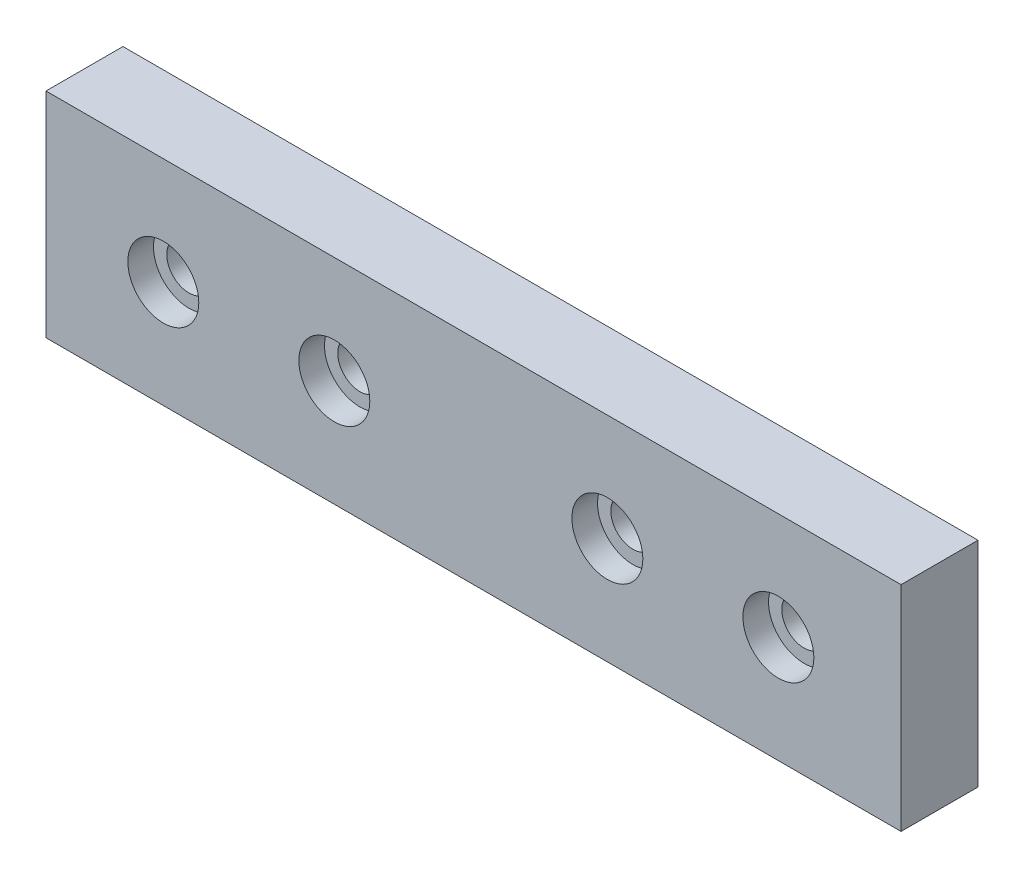
ISO-10303-21;
HEADER;
FILE_DESCRIPTION(('STEP AP214'),'2;1');
FILE_NAME('part.step','',(''),(''),'','','');
FILE_SCHEMA(('AUTOMOTIVE_DESIGN { 1 0 10303 214 1 1 1 1 }'));
ENDSEC;
DATA;
#1=APPLICATION_CONTEXT('core data for automotive mechanical design processes');
#2=APPLICATION_PROTOCOL_DEFINITION('international standard','automotive_design',2000,#1);
#3=PRODUCT_CONTEXT('',#1,'mechanical');
#4=PRODUCT('Part','Part','',(#3));
#5=PRODUCT_RELATED_PRODUCT_CATEGORY('part','',(#4));
#6=PRODUCT_DEFINITION_FORMATION('','',#4);
#7=PRODUCT_DEFINITION_CONTEXT('part definition',#1,'design');
#8=PRODUCT_DEFINITION('design','',#6,#7);
#9=PRODUCT_DEFINITION_SHAPE('','',#8);
#10=(LENGTH_UNIT() NAMED_UNIT(*) SI_UNIT(.MILLI.,.METRE.));
#11=(NAMED_UNIT(*) PLANE_ANGLE_UNIT() SI_UNIT($,.RADIAN.));
#12=(NAMED_UNIT(*) SI_UNIT($,.STERADIAN.) SOLID_ANGLE_UNIT());
#13=UNCERTAINTY_MEASURE_WITH_UNIT(LENGTH_MEASURE(1.E-05),#10,'distance_accuracy_value','');
#14=(GEOMETRIC_REPRESENTATION_CONTEXT(3) GLOBAL_UNCERTAINTY_ASSIGNED_CONTEXT((#13)) GLOBAL_UNIT_ASSIGNED_CONTEXT((#10,
#11,#12)) REPRESENTATION_CONTEXT('',''));
#15=CARTESIAN_POINT('',(0.,0.,0.));
#16=DIRECTION('',(0.,0.,1.));
#17=DIRECTION('',(1.,0.,0.));
#18=AXIS2_PLACEMENT_3D('',#15,#16,#17);
#19=CARTESIAN_POINT('',(-85.3473640143417,12.5,-75.));
#20=DIRECTION('',(0.,0.,1.));
#21=DIRECTION('',(1.,0.,0.));
#22=AXIS2_PLACEMENT_3D('',#19,#20,#21);
#23=CYLINDRICAL_SURFACE('',#22,2.6);
#24=CARTESIAN_POINT('',(-85.3473640143417,12.5,17.5));
#25=DIRECTION('',(0.,0.,1.));
#26=DIRECTION('',(1.,0.,0.));
#27=AXIS2_PLACEMENT_3D('',#24,#25,#26);
#28=CIRCLE('',#27,2.6);
#29=CARTESIAN_POINT('',(-82.7473640143417,12.5,17.5));
#30=VERTEX_POINT('',#29);
#31=EDGE_CURVE('E108',#30,#30,#28,.T.);
#32=ORIENTED_EDGE('',*,*,#31,.F.);
#33=EDGE_LOOP('',(#32));
#34=FACE_BOUND('',#33,.T.);
#35=CARTESIAN_POINT('',(-85.3473640143417,12.5,23.5));
#36=DIRECTION('',(0.,0.,1.));
#37=DIRECTION('',(1.,0.,0.));
#38=AXIS2_PLACEMENT_3D('',#35,#36,#37);
#39=CIRCLE('',#38,2.6);
#40=CARTESIAN_POINT('',(-82.7473640143417,12.5,23.5));
#41=VERTEX_POINT('',#40);
#42=EDGE_CURVE('E36',#41,#41,#39,.F.);
#43=ORIENTED_EDGE('',*,*,#42,.F.);
#44=EDGE_LOOP('',(#43));
#45=FACE_BOUND('',#44,.T.);
#46=ADVANCED_FACE('F32',(#34,#45),#23,.F.);
#47=CARTESIAN_POINT('',(-157.28059455583,12.5,-75.));
#48=DIRECTION('',(0.,0.,1.));
#49=DIRECTION('',(1.,0.,0.));
#50=AXIS2_PLACEMENT_3D('',#47,#48,#49);
#51=CYLINDRICAL_SURFACE('',#50,2.59999999999999);
#52=CARTESIAN_POINT('',(-157.28059455583,12.5,17.5));
#53=DIRECTION('',(0.,0.,1.));
#54=DIRECTION('',(1.,0.,0.));
#55=AXIS2_PLACEMENT_3D('',#52,#53,#54);
#56=CIRCLE('',#55,2.59999999999999);
#57=CARTESIAN_POINT('',(-154.68059455583,12.5,17.5));
#58=VERTEX_POINT('',#57);
#59=EDGE_CURVE('E111',#58,#58,#56,.T.);
#60=ORIENTED_EDGE('',*,*,#59,.F.);
#61=EDGE_LOOP('',(#60));
#62=FACE_BOUND('',#61,.T.);
#63=CARTESIAN_POINT('',(-157.28059455583,12.5,23.5));
#64=DIRECTION('',(0.,0.,1.));
#65=DIRECTION('',(1.,0.,0.));
#66=AXIS2_PLACEMENT_3D('',#63,#64,#65);
#67=CIRCLE('',#66,2.59999999999999);
#68=CARTESIAN_POINT('',(-154.68059455583,12.5,23.5));
#69=VERTEX_POINT('',#68);
#70=EDGE_CURVE('E125',#69,#69,#67,.F.);
#71=ORIENTED_EDGE('',*,*,#70,.F.);
#72=EDGE_LOOP('',(#71));
#73=FACE_BOUND('',#72,.T.);
#74=ADVANCED_FACE('F135',(#62,#73),#51,.F.);
#75=CARTESIAN_POINT('',(-105.347364014342,12.5,-75.));
#76=DIRECTION('',(0.,0.,1.));
#77=DIRECTION('',(1.,0.,0.));
#78=AXIS2_PLACEMENT_3D('',#75,#76,#77);
#79=CYLINDRICAL_SURFACE('',#78,2.6);
#80=CARTESIAN_POINT('',(-105.347364014342,12.5,17.5));
#81=DIRECTION('',(0.,0.,1.));
#82=DIRECTION('',(1.,0.,0.));
#83=AXIS2_PLACEMENT_3D('',#80,#81,#82);
#84=CIRCLE('',#83,2.6);
#85=CARTESIAN_POINT('',(-102.747364014342,12.5,17.5));
#86=VERTEX_POINT('',#85);
#87=EDGE_CURVE('E114',#86,#86,#84,.T.);
#88=ORIENTED_EDGE('',*,*,#87,.F.);
#89=EDGE_LOOP('',(#88));
#90=FACE_BOUND('',#89,.T.);
#91=CARTESIAN_POINT('',(-105.347364014342,12.5,23.5));
#92=DIRECTION('',(0.,0.,1.));
#93=DIRECTION('',(1.,0.,0.));
#94=AXIS2_PLACEMENT_3D('',#91,#92,#93);
#95=CIRCLE('',#94,2.6);
#96=CARTESIAN_POINT('',(-102.747364014342,12.5,23.5));
#97=VERTEX_POINT('',#96);
#98=EDGE_CURVE('E122',#97,#97,#95,.F.);
#99=ORIENTED_EDGE('',*,*,#98,.F.);
#100=EDGE_LOOP('',(#99));
#101=FACE_BOUND('',#100,.T.);
#102=ADVANCED_FACE('F141',(#90,#101),#79,.F.);
#103=CARTESIAN_POINT('',(-137.28059455583,12.5,-75.));
#104=DIRECTION('',(0.,0.,1.));
#105=DIRECTION('',(1.,0.,0.));
#106=AXIS2_PLACEMENT_3D('',#103,#104,#105);
#107=CYLINDRICAL_SURFACE('',#106,2.59999999999999);
#108=CARTESIAN_POINT('',(-137.28059455583,12.5,17.5));
#109=DIRECTION('',(0.,0.,1.));
#110=DIRECTION('',(1.,0.,0.));
#111=AXIS2_PLACEMENT_3D('',#108,#109,#110);
#112=CIRCLE('',#111,2.59999999999999);
#113=CARTESIAN_POINT('',(-134.68059455583,12.5,17.5));
#114=VERTEX_POINT('',#113);
#115=EDGE_CURVE('E102',#114,#114,#112,.T.);
#116=ORIENTED_EDGE('',*,*,#115,.F.);
#117=EDGE_LOOP('',(#116));
#118=FACE_BOUND('',#117,.T.);
#119=CARTESIAN_POINT('',(-137.28059455583,12.5,23.5));
#120=DIRECTION('',(0.,0.,1.));
#121=DIRECTION('',(1.,0.,0.));
#122=AXIS2_PLACEMENT_3D('',#119,#120,#121);
#123=CIRCLE('',#122,2.59999999999999);
#124=CARTESIAN_POINT('',(-134.68059455583,12.5,23.5));
#125=VERTEX_POINT('',#124);
#126=EDGE_CURVE('E119',#125,#125,#123,.F.);
#127=ORIENTED_EDGE('',*,*,#126,.F.);
#128=EDGE_LOOP('',(#127));
#129=FACE_BOUND('',#128,.T.);
#130=ADVANCED_FACE('F163',(#118,#129),#107,.F.);
#131=CARTESIAN_POINT('',(-71.,0.,26.5));
#132=DIRECTION('',(-1.,0.,0.));
#133=DIRECTION('',(0.,0.,1.));
#134=AXIS2_PLACEMENT_3D('',#131,#132,#133);
#135=PLANE('',#134);
#136=DIRECTION('',(0.,1.,0.));
#137=VECTOR('',#136,1.);
#138=CARTESIAN_POINT('',(-71.,0.,17.5));
#139=LINE('',#138,#137);
#140=CARTESIAN_POINT('',(-71.,0.,17.5));
#141=VERTEX_POINT('',#140);
#142=CARTESIAN_POINT('',(-71.,25.,17.5));
#143=VERTEX_POINT('',#142);
#144=EDGE_CURVE('E99',#141,#143,#139,.T.);
#145=ORIENTED_EDGE('',*,*,#144,.T.);
#146=DIRECTION('',(0.,0.,-1.));
#147=VECTOR('',#146,1.);
#148=CARTESIAN_POINT('',(-71.,25.,26.5));
#149=LINE('',#148,#147);
#150=CARTESIAN_POINT('',(-71.,25.,26.5));
#151=VERTEX_POINT('',#150);
#152=EDGE_CURVE('E11',#151,#143,#149,.T.);
#153=ORIENTED_EDGE('',*,*,#152,.F.);
#154=DIRECTION('',(0.,1.,0.));
#155=VECTOR('',#154,1.);
#156=CARTESIAN_POINT('',(-71.,0.,26.5));
#157=LINE('',#156,#155);
#158=CARTESIAN_POINT('',(-71.,0.,26.5));
#159=VERTEX_POINT('',#158);
#160=EDGE_CURVE('E86',#159,#151,#157,.T.);
#161=ORIENTED_EDGE('',*,*,#160,.F.);
#162=DIRECTION('',(0.,0.,-1.));
#163=VECTOR('',#162,1.);
#164=CARTESIAN_POINT('',(-71.,0.,26.5));
#165=LINE('',#164,#163);
#166=EDGE_CURVE('E95',#159,#141,#165,.T.);
#167=ORIENTED_EDGE('',*,*,#166,.T.);
#168=EDGE_LOOP('',(#145,#153,#161,#167));
#169=FACE_BOUND('',#168,.T.);
#170=ADVANCED_FACE('F34',(#169),#135,.F.);
#171=CARTESIAN_POINT('',(-71.,25.,26.5));
#172=DIRECTION('',(0.,-1.,0.));
#173=DIRECTION('',(0.,0.,-1.));
#174=AXIS2_PLACEMENT_3D('',#171,#172,#173);
#175=PLANE('',#174);
#176=DIRECTION('',(-1.,0.,0.));
#177=VECTOR('',#176,1.);
#178=CARTESIAN_POINT('',(-71.,25.,17.5));
#179=LINE('',#178,#177);
#180=CARTESIAN_POINT('',(-171.,25.,17.5));
#181=VERTEX_POINT('',#180);
#182=EDGE_CURVE('E90',#143,#181,#179,.T.);
#183=ORIENTED_EDGE('',*,*,#182,.T.);
#184=DIRECTION('',(0.,0.,-1.));
#185=VECTOR('',#184,1.);
#186=CARTESIAN_POINT('',(-171.,25.,26.5));
#187=LINE('',#186,#185);
#188=CARTESIAN_POINT('',(-171.,25.,26.5));
#189=VERTEX_POINT('',#188);
#190=EDGE_CURVE('E42',#189,#181,#187,.T.);
#191=ORIENTED_EDGE('',*,*,#190,.F.);
#192=DIRECTION('',(-1.,0.,0.));
#193=VECTOR('',#192,1.);
#194=CARTESIAN_POINT('',(-71.,25.,26.5));
#195=LINE('',#194,#193);
#196=EDGE_CURVE('E81',#151,#189,#195,.T.);
#197=ORIENTED_EDGE('',*,*,#196,.F.);
#198=ORIENTED_EDGE('',*,*,#152,.T.);
#199=EDGE_LOOP('',(#183,#191,#197,#198));
#200=FACE_BOUND('',#199,.T.);
#201=ADVANCED_FACE('F89',(#200),#175,.F.);
#202=CARTESIAN_POINT('',(-171.,25.,26.5));
#203=DIRECTION('',(1.,0.,0.));
#204=DIRECTION('',(0.,0.,-1.));
#205=AXIS2_PLACEMENT_3D('',#202,#203,#204);
#206=PLANE('',#205);
#207=DIRECTION('',(0.,-1.,0.));
#208=VECTOR('',#207,1.);
#209=CARTESIAN_POINT('',(-171.,25.,17.5));
#210=LINE('',#209,#208);
#211=CARTESIAN_POINT('',(-171.,0.,17.5));
#212=VERTEX_POINT('',#211);
#213=EDGE_CURVE('E68',#181,#212,#210,.T.);
#214=ORIENTED_EDGE('',*,*,#213,.T.);
#215=DIRECTION('',(0.,0.,-1.));
#216=VECTOR('',#215,1.);
#217=CARTESIAN_POINT('',(-171.,0.,26.5));
#218=LINE('',#217,#216);
#219=CARTESIAN_POINT('',(-171.,0.,26.5));
#220=VERTEX_POINT('',#219);
#221=EDGE_CURVE('E91',#220,#212,#218,.T.);
#222=ORIENTED_EDGE('',*,*,#221,.F.);
#223=DIRECTION('',(0.,-1.,0.));
#224=VECTOR('',#223,1.);
#225=CARTESIAN_POINT('',(-171.,25.,26.5));
#226=LINE('',#225,#224);
#227=EDGE_CURVE('E84',#189,#220,#226,.T.);
#228=ORIENTED_EDGE('',*,*,#227,.F.);
#229=ORIENTED_EDGE('',*,*,#190,.T.);
#230=EDGE_LOOP('',(#214,#222,#228,#229));
#231=FACE_BOUND('',#230,.T.);
#232=ADVANCED_FACE('F93',(#231),#206,.F.);
#233=CARTESIAN_POINT('',(-171.,0.,26.5));
#234=DIRECTION('',(0.,1.,0.));
#235=DIRECTION('',(-1.,0.,0.));
#236=AXIS2_PLACEMENT_3D('',#233,#234,#235);
#237=PLANE('',#236);
#238=DIRECTION('',(1.,0.,0.));
#239=VECTOR('',#238,1.);
#240=CARTESIAN_POINT('',(-171.,0.,17.5));
#241=LINE('',#240,#239);
#242=EDGE_CURVE('E74',#212,#141,#241,.T.);
#243=ORIENTED_EDGE('',*,*,#242,.T.);
#244=ORIENTED_EDGE('',*,*,#166,.F.);
#245=DIRECTION('',(1.,0.,0.));
#246=VECTOR('',#245,1.);
#247=CARTESIAN_POINT('',(-171.,0.,26.5));
#248=LINE('',#247,#246);
#249=EDGE_CURVE('E51',#220,#159,#248,.T.);
#250=ORIENTED_EDGE('',*,*,#249,.F.);
#251=ORIENTED_EDGE('',*,*,#221,.T.);
#252=EDGE_LOOP('',(#243,#244,#250,#251));
#253=FACE_BOUND('',#252,.T.);
#254=ADVANCED_FACE('F150',(#253),#237,.F.);
#255=CARTESIAN_POINT('',(0.,0.,26.5));
#256=DIRECTION('',(0.,0.,1.));
#257=DIRECTION('',(1.,0.,0.));
#258=AXIS2_PLACEMENT_3D('',#255,#256,#257);
#259=PLANE('',#258);
#260=CARTESIAN_POINT('',(-137.28059455583,12.5,26.5));
#261=DIRECTION('',(0.,0.,1.));
#262=DIRECTION('',(1.,0.,0.));
#263=AXIS2_PLACEMENT_3D('',#260,#261,#262);
#264=CIRCLE('',#263,4.14999999999998);
#265=CARTESIAN_POINT('',(-133.13059455583,12.5,26.5));
#266=VERTEX_POINT('',#265);
#267=EDGE_CURVE('E191',#266,#266,#264,.T.);
#268=ORIENTED_EDGE('',*,*,#267,.F.);
#269=EDGE_LOOP('',(#268));
#270=FACE_BOUND('',#269,.T.);
#271=CARTESIAN_POINT('',(-105.347364014342,12.5,26.5));
#272=DIRECTION('',(0.,0.,1.));
#273=DIRECTION('',(1.,0.,0.));
#274=AXIS2_PLACEMENT_3D('',#271,#272,#273);
#275=CIRCLE('',#274,4.15);
#276=CARTESIAN_POINT('',(-101.197364014342,12.5,26.5));
#277=VERTEX_POINT('',#276);
#278=EDGE_CURVE('E185',#277,#277,#275,.T.);
#279=ORIENTED_EDGE('',*,*,#278,.F.);
#280=EDGE_LOOP('',(#279));
#281=FACE_BOUND('',#280,.T.);
#282=CARTESIAN_POINT('',(-157.28059455583,12.5,26.5));
#283=DIRECTION('',(0.,0.,1.));
#284=DIRECTION('',(1.,0.,0.));
#285=AXIS2_PLACEMENT_3D('',#282,#283,#284);
#286=CIRCLE('',#285,4.14999999999998);
#287=CARTESIAN_POINT('',(-153.13059455583,12.5,26.5));
#288=VERTEX_POINT('',#287);
#289=EDGE_CURVE('E179',#288,#288,#286,.T.);
#290=ORIENTED_EDGE('',*,*,#289,.F.);
#291=EDGE_LOOP('',(#290));
#292=FACE_BOUND('',#291,.T.);
#293=CARTESIAN_POINT('',(-85.3473640143417,12.5,26.5));
#294=DIRECTION('',(0.,0.,1.));
#295=DIRECTION('',(1.,0.,0.));
#296=AXIS2_PLACEMENT_3D('',#293,#294,#295);
#297=CIRCLE('',#296,4.15);
#298=CARTESIAN_POINT('',(-81.1973640143417,12.5,26.5));
#299=VERTEX_POINT('',#298);
#300=EDGE_CURVE('E173',#299,#299,#297,.T.);
#301=ORIENTED_EDGE('',*,*,#300,.F.);
#302=EDGE_LOOP('',(#301));
#303=FACE_BOUND('',#302,.T.);
#304=ORIENTED_EDGE('',*,*,#160,.T.);
#305=ORIENTED_EDGE('',*,*,#196,.T.);
#306=ORIENTED_EDGE('',*,*,#227,.T.);
#307=ORIENTED_EDGE('',*,*,#249,.T.);
#308=EDGE_LOOP('',(#304,#305,#306,#307));
#309=FACE_BOUND('',#308,.T.);
#310=ADVANCED_FACE('F82',(#270,#281,#292,#303,#309),#259,.T.);
#311=CARTESIAN_POINT('',(0.,0.,17.5));
#312=DIRECTION('',(0.,0.,1.));
#313=DIRECTION('',(1.,0.,0.));
#314=AXIS2_PLACEMENT_3D('',#311,#312,#313);
#315=PLANE('',#314);
#316=ORIENTED_EDGE('',*,*,#115,.T.);
#317=EDGE_LOOP('',(#316));
#318=FACE_BOUND('',#317,.T.);
#319=ORIENTED_EDGE('',*,*,#87,.T.);
#320=EDGE_LOOP('',(#319));
#321=FACE_BOUND('',#320,.T.);
#322=ORIENTED_EDGE('',*,*,#59,.T.);
#323=EDGE_LOOP('',(#322));
#324=FACE_BOUND('',#323,.T.);
#325=ORIENTED_EDGE('',*,*,#31,.T.);
#326=EDGE_LOOP('',(#325));
#327=FACE_BOUND('',#326,.T.);
#328=ORIENTED_EDGE('',*,*,#144,.F.);
#329=ORIENTED_EDGE('',*,*,#242,.F.);
#330=ORIENTED_EDGE('',*,*,#213,.F.);
#331=ORIENTED_EDGE('',*,*,#182,.F.);
#332=EDGE_LOOP('',(#328,#329,#330,#331));
#333=FACE_BOUND('',#332,.T.);
#334=ADVANCED_FACE('F149',(#318,#321,#324,#327,#333),#315,.F.);
#335=CARTESIAN_POINT('',(-137.28059455583,12.5,23.5));
#336=DIRECTION('',(0.,0.,1.));
#337=DIRECTION('',(1.,0.,0.));
#338=AXIS2_PLACEMENT_3D('',#335,#336,#337);
#339=PLANE('',#338);
#340=CARTESIAN_POINT('',(-137.28059455583,12.5,23.5));
#341=DIRECTION('',(0.,0.,1.));
#342=DIRECTION('',(1.,0.,0.));
#343=AXIS2_PLACEMENT_3D('',#340,#341,#342);
#344=CIRCLE('',#343,4.14999999999998);
#345=CARTESIAN_POINT('',(-133.13059455583,12.5,23.5));
#346=VERTEX_POINT('',#345);
#347=EDGE_CURVE('E123',#346,#346,#344,.T.);
#348=ORIENTED_EDGE('',*,*,#347,.T.);
#349=EDGE_LOOP('',(#348));
#350=FACE_BOUND('',#349,.T.);
#351=ORIENTED_EDGE('',*,*,#126,.T.);
#352=EDGE_LOOP('',(#351));
#353=FACE_BOUND('',#352,.T.);
#354=ADVANCED_FACE('F154',(#350,#353),#339,.T.);
#355=CARTESIAN_POINT('',(-137.28059455583,12.5,23.5));
#356=DIRECTION('',(0.,0.,1.));
#357=DIRECTION('',(1.,0.,0.));
#358=AXIS2_PLACEMENT_3D('',#355,#356,#357);
#359=CYLINDRICAL_SURFACE('',#358,4.14999999999998);
#360=ORIENTED_EDGE('',*,*,#347,.F.);
#361=EDGE_LOOP('',(#360));
#362=FACE_BOUND('',#361,.T.);
#363=ORIENTED_EDGE('',*,*,#267,.T.);
#364=EDGE_LOOP('',(#363));
#365=FACE_BOUND('',#364,.T.);
#366=ADVANCED_FACE('F199',(#362,#365),#359,.F.);
#367=CARTESIAN_POINT('',(-105.347364014342,12.5,23.5));
#368=DIRECTION('',(0.,0.,1.));
#369=DIRECTION('',(1.,0.,0.));
#370=AXIS2_PLACEMENT_3D('',#367,#368,#369);
#371=PLANE('',#370);
#372=CARTESIAN_POINT('',(-105.347364014342,12.5,23.5));
#373=DIRECTION('',(0.,0.,1.));
#374=DIRECTION('',(1.,0.,0.));
#375=AXIS2_PLACEMENT_3D('',#372,#373,#374);
#376=CIRCLE('',#375,4.15);
#377=CARTESIAN_POINT('',(-101.197364014342,12.5,23.5));
#378=VERTEX_POINT('',#377);
#379=EDGE_CURVE('E188',#378,#378,#376,.T.);
#380=ORIENTED_EDGE('',*,*,#379,.T.);
#381=EDGE_LOOP('',(#380));
#382=FACE_BOUND('',#381,.T.);
#383=ORIENTED_EDGE('',*,*,#98,.T.);
#384=EDGE_LOOP('',(#383));
#385=FACE_BOUND('',#384,.T.);
#386=ADVANCED_FACE('F202',(#382,#385),#371,.T.);
#387=CARTESIAN_POINT('',(-105.347364014342,12.5,23.5));
#388=DIRECTION('',(0.,0.,1.));
#389=DIRECTION('',(1.,0.,0.));
#390=AXIS2_PLACEMENT_3D('',#387,#388,#389);
#391=CYLINDRICAL_SURFACE('',#390,4.15);
#392=ORIENTED_EDGE('',*,*,#379,.F.);
#393=EDGE_LOOP('',(#392));
#394=FACE_BOUND('',#393,.T.);
#395=ORIENTED_EDGE('',*,*,#278,.T.);
#396=EDGE_LOOP('',(#395));
#397=FACE_BOUND('',#396,.T.);
#398=ADVANCED_FACE('F233',(#394,#397),#391,.F.);
#399=CARTESIAN_POINT('',(-157.28059455583,12.5,23.5));
#400=DIRECTION('',(0.,0.,1.));
#401=DIRECTION('',(1.,0.,0.));
#402=AXIS2_PLACEMENT_3D('',#399,#400,#401);
#403=PLANE('',#402);
#404=CARTESIAN_POINT('',(-157.28059455583,12.5,23.5));
#405=DIRECTION('',(0.,0.,1.));
#406=DIRECTION('',(1.,0.,0.));
#407=AXIS2_PLACEMENT_3D('',#404,#405,#406);
#408=CIRCLE('',#407,4.14999999999998);
#409=CARTESIAN_POINT('',(-153.13059455583,12.5,23.5));
#410=VERTEX_POINT('',#409);
#411=EDGE_CURVE('E182',#410,#410,#408,.T.);
#412=ORIENTED_EDGE('',*,*,#411,.T.);
#413=EDGE_LOOP('',(#412));
#414=FACE_BOUND('',#413,.T.);
#415=ORIENTED_EDGE('',*,*,#70,.T.);
#416=EDGE_LOOP('',(#415));
#417=FACE_BOUND('',#416,.T.);
#418=ADVANCED_FACE('F239',(#414,#417),#403,.T.);
#419=CARTESIAN_POINT('',(-157.28059455583,12.5,23.5));
#420=DIRECTION('',(0.,0.,1.));
#421=DIRECTION('',(1.,0.,0.));
#422=AXIS2_PLACEMENT_3D('',#419,#420,#421);
#423=CYLINDRICAL_SURFACE('',#422,4.14999999999998);
#424=ORIENTED_EDGE('',*,*,#411,.F.);
#425=EDGE_LOOP('',(#424));
#426=FACE_BOUND('',#425,.T.);
#427=ORIENTED_EDGE('',*,*,#289,.T.);
#428=EDGE_LOOP('',(#427));
#429=FACE_BOUND('',#428,.T.);
#430=ADVANCED_FACE('F219',(#426,#429),#423,.F.);
#431=CARTESIAN_POINT('',(-85.3473640143417,12.5,23.5));
#432=DIRECTION('',(0.,0.,1.));
#433=DIRECTION('',(1.,0.,0.));
#434=AXIS2_PLACEMENT_3D('',#431,#432,#433);
#435=PLANE('',#434);
#436=CARTESIAN_POINT('',(-85.3473640143417,12.5,23.5));
#437=DIRECTION('',(0.,0.,1.));
#438=DIRECTION('',(1.,0.,0.));
#439=AXIS2_PLACEMENT_3D('',#436,#437,#438);
#440=CIRCLE('',#439,4.15);
#441=CARTESIAN_POINT('',(-81.1973640143417,12.5,23.5));
#442=VERTEX_POINT('',#441);
#443=EDGE_CURVE('E176',#442,#442,#440,.T.);
#444=ORIENTED_EDGE('',*,*,#443,.T.);
#445=EDGE_LOOP('',(#444));
#446=FACE_BOUND('',#445,.T.);
#447=ORIENTED_EDGE('',*,*,#42,.T.);
#448=EDGE_LOOP('',(#447));
#449=FACE_BOUND('',#448,.T.);
#450=ADVANCED_FACE('F132',(#446,#449),#435,.T.);
#451=CARTESIAN_POINT('',(-85.3473640143417,12.5,23.5));
#452=DIRECTION('',(0.,0.,1.));
#453=DIRECTION('',(1.,0.,0.));
#454=AXIS2_PLACEMENT_3D('',#451,#452,#453);
#455=CYLINDRICAL_SURFACE('',#454,4.15);
#456=ORIENTED_EDGE('',*,*,#443,.F.);
#457=EDGE_LOOP('',(#456));
#458=FACE_BOUND('',#457,.T.);
#459=ORIENTED_EDGE('',*,*,#300,.T.);
#460=EDGE_LOOP('',(#459));
#461=FACE_BOUND('',#460,.T.);
#462=ADVANCED_FACE('F212',(#458,#461),#455,.F.);
#463=CLOSED_SHELL('',(#46,#74,#102,#130,#170,#201,#232,#254,#310,#334,#354,#366,#386,#398,#418,
#430,#450,#462));
#464=MANIFOLD_SOLID_BREP('B2',#463);
#465=ADVANCED_BREP_SHAPE_REPRESENTATION('',(#18,#464),#14);
#466=SHAPE_DEFINITION_REPRESENTATION(#9,#465);
ENDSEC;
END-ISO-10303-21;
